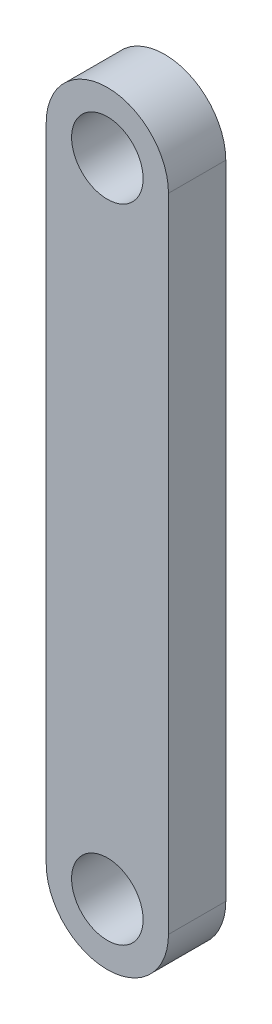
ISO-10303-21;
HEADER;
FILE_DESCRIPTION(('STEP AP214'),'2;1');
FILE_NAME('part.step','',(''),(''),'','','');
FILE_SCHEMA(('AUTOMOTIVE_DESIGN { 1 0 10303 214 1 1 1 1 }'));
ENDSEC;
DATA;
#1=APPLICATION_CONTEXT('core data for automotive mechanical design processes');
#2=APPLICATION_PROTOCOL_DEFINITION('international standard','automotive_design',2000,#1);
#3=PRODUCT_CONTEXT('',#1,'mechanical');
#4=PRODUCT('Part','Part','',(#3));
#5=PRODUCT_RELATED_PRODUCT_CATEGORY('part','',(#4));
#6=PRODUCT_DEFINITION_FORMATION('','',#4);
#7=PRODUCT_DEFINITION_CONTEXT('part definition',#1,'design');
#8=PRODUCT_DEFINITION('design','',#6,#7);
#9=PRODUCT_DEFINITION_SHAPE('','',#8);
#10=(LENGTH_UNIT() NAMED_UNIT(*) SI_UNIT(.MILLI.,.METRE.));
#11=(NAMED_UNIT(*) PLANE_ANGLE_UNIT() SI_UNIT($,.RADIAN.));
#12=(NAMED_UNIT(*) SI_UNIT($,.STERADIAN.) SOLID_ANGLE_UNIT());
#13=UNCERTAINTY_MEASURE_WITH_UNIT(LENGTH_MEASURE(1.E-05),#10,'distance_accuracy_value','');
#14=(GEOMETRIC_REPRESENTATION_CONTEXT(3) GLOBAL_UNCERTAINTY_ASSIGNED_CONTEXT((#13)) GLOBAL_UNIT_ASSIGNED_CONTEXT((#10,
#11,#12)) REPRESENTATION_CONTEXT('',''));
#15=CARTESIAN_POINT('',(0.,0.,0.));
#16=DIRECTION('',(0.,0.,1.));
#17=DIRECTION('',(1.,0.,0.));
#18=AXIS2_PLACEMENT_3D('',#15,#16,#17);
#19=CARTESIAN_POINT('',(0.,33.6,3.));
#20=DIRECTION('',(0.,0.,1.));
#21=DIRECTION('',(1.,0.,0.));
#22=AXIS2_PLACEMENT_3D('',#19,#20,#21);
#23=PLANE('',#22);
#24=CARTESIAN_POINT('',(0.,0.,3.));
#25=DIRECTION('',(0.,0.,1.));
#26=DIRECTION('',(1.,0.,0.));
#27=AXIS2_PLACEMENT_3D('',#24,#25,#26);
#28=CIRCLE('',#27,1.872);
#29=CARTESIAN_POINT('',(1.872,0.,3.));
#30=VERTEX_POINT('',#29);
#31=EDGE_CURVE('E108',#30,#30,#28,.T.);
#32=ORIENTED_EDGE('',*,*,#31,.F.);
#33=EDGE_LOOP('',(#32));
#34=FACE_BOUND('',#33,.T.);
#35=CARTESIAN_POINT('',(0.,33.6,3.));
#36=DIRECTION('',(0.,0.,1.));
#37=DIRECTION('',(1.,0.,0.));
#38=AXIS2_PLACEMENT_3D('',#35,#36,#37);
#39=CIRCLE('',#38,3.2);
#40=CARTESIAN_POINT('',(3.2,33.6,3.));
#41=VERTEX_POINT('',#40);
#42=CARTESIAN_POINT('',(-3.2,33.6,3.));
#43=VERTEX_POINT('',#42);
#44=EDGE_CURVE('E93',#41,#43,#39,.T.);
#45=ORIENTED_EDGE('',*,*,#44,.T.);
#46=DIRECTION('',(0.,-1.,0.));
#47=VECTOR('',#46,1.);
#48=CARTESIAN_POINT('',(-3.2,33.6,3.));
#49=LINE('',#48,#47);
#50=CARTESIAN_POINT('',(-3.2,0.,3.));
#51=VERTEX_POINT('',#50);
#52=EDGE_CURVE('E88',#43,#51,#49,.T.);
#53=ORIENTED_EDGE('',*,*,#52,.T.);
#54=CARTESIAN_POINT('',(0.,0.,3.));
#55=DIRECTION('',(0.,0.,1.));
#56=DIRECTION('',(1.,0.,0.));
#57=AXIS2_PLACEMENT_3D('',#54,#55,#56);
#58=CIRCLE('',#57,3.2);
#59=CARTESIAN_POINT('',(3.19999999999999,0.,3.));
#60=VERTEX_POINT('',#59);
#61=EDGE_CURVE('E91',#51,#60,#58,.T.);
#62=ORIENTED_EDGE('',*,*,#61,.T.);
#63=DIRECTION('',(0.,1.,0.));
#64=VECTOR('',#63,1.);
#65=CARTESIAN_POINT('',(3.2,33.6,3.));
#66=LINE('',#65,#64);
#67=EDGE_CURVE('E58',#60,#41,#66,.T.);
#68=ORIENTED_EDGE('',*,*,#67,.T.);
#69=EDGE_LOOP('',(#45,#53,#62,#68));
#70=FACE_BOUND('',#69,.T.);
#71=CARTESIAN_POINT('',(0.,33.6,3.));
#72=DIRECTION('',(0.,0.,1.));
#73=DIRECTION('',(1.,0.,0.));
#74=AXIS2_PLACEMENT_3D('',#71,#72,#73);
#75=CIRCLE('',#74,1.872);
#76=CARTESIAN_POINT('',(1.872,33.6,3.));
#77=VERTEX_POINT('',#76);
#78=EDGE_CURVE('E123',#77,#77,#75,.T.);
#79=ORIENTED_EDGE('',*,*,#78,.F.);
#80=EDGE_LOOP('',(#79));
#81=FACE_BOUND('',#80,.T.);
#82=ADVANCED_FACE('F41',(#34,#70,#81),#23,.T.);
#83=CARTESIAN_POINT('',(0.,33.6,0.));
#84=DIRECTION('',(0.,0.,1.));
#85=DIRECTION('',(1.,0.,0.));
#86=AXIS2_PLACEMENT_3D('',#83,#84,#85);
#87=PLANE('',#86);
#88=CARTESIAN_POINT('',(0.,33.6,0.));
#89=DIRECTION('',(0.,0.,1.));
#90=DIRECTION('',(1.,0.,0.));
#91=AXIS2_PLACEMENT_3D('',#88,#89,#90);
#92=CIRCLE('',#91,3.2);
#93=CARTESIAN_POINT('',(3.2,33.6,0.));
#94=VERTEX_POINT('',#93);
#95=CARTESIAN_POINT('',(-3.2,33.6,0.));
#96=VERTEX_POINT('',#95);
#97=EDGE_CURVE('E105',#94,#96,#92,.T.);
#98=ORIENTED_EDGE('',*,*,#97,.F.);
#99=DIRECTION('',(0.,1.,0.));
#100=VECTOR('',#99,1.);
#101=CARTESIAN_POINT('',(3.2,33.6,0.));
#102=LINE('',#101,#100);
#103=CARTESIAN_POINT('',(3.19999999999999,0.,0.));
#104=VERTEX_POINT('',#103);
#105=EDGE_CURVE('E81',#104,#94,#102,.T.);
#106=ORIENTED_EDGE('',*,*,#105,.F.);
#107=CARTESIAN_POINT('',(0.,0.,0.));
#108=DIRECTION('',(0.,0.,1.));
#109=DIRECTION('',(1.,0.,0.));
#110=AXIS2_PLACEMENT_3D('',#107,#108,#109);
#111=CIRCLE('',#110,3.2);
#112=CARTESIAN_POINT('',(-3.2,0.,0.));
#113=VERTEX_POINT('',#112);
#114=EDGE_CURVE('E75',#113,#104,#111,.T.);
#115=ORIENTED_EDGE('',*,*,#114,.F.);
#116=DIRECTION('',(0.,-1.,0.));
#117=VECTOR('',#116,1.);
#118=CARTESIAN_POINT('',(-3.2,33.6,0.));
#119=LINE('',#118,#117);
#120=EDGE_CURVE('E97',#96,#113,#119,.T.);
#121=ORIENTED_EDGE('',*,*,#120,.F.);
#122=EDGE_LOOP('',(#98,#106,#115,#121));
#123=FACE_BOUND('',#122,.T.);
#124=CARTESIAN_POINT('',(0.,0.,0.));
#125=DIRECTION('',(0.,0.,1.));
#126=DIRECTION('',(1.,0.,0.));
#127=AXIS2_PLACEMENT_3D('',#124,#125,#126);
#128=CIRCLE('',#127,1.872);
#129=CARTESIAN_POINT('',(1.872,0.,0.));
#130=VERTEX_POINT('',#129);
#131=EDGE_CURVE('E120',#130,#130,#128,.T.);
#132=ORIENTED_EDGE('',*,*,#131,.T.);
#133=EDGE_LOOP('',(#132));
#134=FACE_BOUND('',#133,.T.);
#135=CARTESIAN_POINT('',(0.,33.6,0.));
#136=DIRECTION('',(0.,0.,1.));
#137=DIRECTION('',(1.,0.,0.));
#138=AXIS2_PLACEMENT_3D('',#135,#136,#137);
#139=CIRCLE('',#138,1.872);
#140=CARTESIAN_POINT('',(1.872,33.6,0.));
#141=VERTEX_POINT('',#140);
#142=EDGE_CURVE('E126',#141,#141,#139,.T.);
#143=ORIENTED_EDGE('',*,*,#142,.T.);
#144=EDGE_LOOP('',(#143));
#145=FACE_BOUND('',#144,.T.);
#146=ADVANCED_FACE('F116',(#123,#134,#145),#87,.F.);
#147=CARTESIAN_POINT('',(0.,33.6,3.));
#148=DIRECTION('',(0.,0.,-1.));
#149=DIRECTION('',(-1.,0.,0.));
#150=AXIS2_PLACEMENT_3D('',#147,#148,#149);
#151=CYLINDRICAL_SURFACE('',#150,3.2);
#152=ORIENTED_EDGE('',*,*,#97,.T.);
#153=DIRECTION('',(0.,0.,-1.));
#154=VECTOR('',#153,1.);
#155=CARTESIAN_POINT('',(-3.2,33.6,3.));
#156=LINE('',#155,#154);
#157=EDGE_CURVE('E11',#43,#96,#156,.T.);
#158=ORIENTED_EDGE('',*,*,#157,.F.);
#159=ORIENTED_EDGE('',*,*,#44,.F.);
#160=DIRECTION('',(0.,0.,-1.));
#161=VECTOR('',#160,1.);
#162=CARTESIAN_POINT('',(3.2,33.6,3.));
#163=LINE('',#162,#161);
#164=EDGE_CURVE('E101',#41,#94,#163,.T.);
#165=ORIENTED_EDGE('',*,*,#164,.T.);
#166=EDGE_LOOP('',(#152,#158,#159,#165));
#167=FACE_BOUND('',#166,.T.);
#168=ADVANCED_FACE('F43',(#167),#151,.T.);
#169=CARTESIAN_POINT('',(-3.2,33.6,3.));
#170=DIRECTION('',(1.,0.,0.));
#171=DIRECTION('',(0.,1.,0.));
#172=AXIS2_PLACEMENT_3D('',#169,#170,#171);
#173=PLANE('',#172);
#174=ORIENTED_EDGE('',*,*,#120,.T.);
#175=DIRECTION('',(0.,0.,-1.));
#176=VECTOR('',#175,1.);
#177=CARTESIAN_POINT('',(-3.2,0.,3.));
#178=LINE('',#177,#176);
#179=EDGE_CURVE('E50',#51,#113,#178,.T.);
#180=ORIENTED_EDGE('',*,*,#179,.F.);
#181=ORIENTED_EDGE('',*,*,#52,.F.);
#182=ORIENTED_EDGE('',*,*,#157,.T.);
#183=EDGE_LOOP('',(#174,#180,#181,#182));
#184=FACE_BOUND('',#183,.T.);
#185=ADVANCED_FACE('F96',(#184),#173,.F.);
#186=CARTESIAN_POINT('',(0.,0.,3.));
#187=DIRECTION('',(0.,0.,-1.));
#188=DIRECTION('',(-1.,0.,0.));
#189=AXIS2_PLACEMENT_3D('',#186,#187,#188);
#190=CYLINDRICAL_SURFACE('',#189,3.2);
#191=ORIENTED_EDGE('',*,*,#114,.T.);
#192=DIRECTION('',(0.,0.,-1.));
#193=VECTOR('',#192,1.);
#194=CARTESIAN_POINT('',(3.19999999999999,0.,3.));
#195=LINE('',#194,#193);
#196=EDGE_CURVE('E98',#60,#104,#195,.T.);
#197=ORIENTED_EDGE('',*,*,#196,.F.);
#198=ORIENTED_EDGE('',*,*,#61,.F.);
#199=ORIENTED_EDGE('',*,*,#179,.T.);
#200=EDGE_LOOP('',(#191,#197,#198,#199));
#201=FACE_BOUND('',#200,.T.);
#202=ADVANCED_FACE('F99',(#201),#190,.T.);
#203=CARTESIAN_POINT('',(3.2,33.6,3.));
#204=DIRECTION('',(-1.,0.,0.));
#205=DIRECTION('',(0.,-1.,0.));
#206=AXIS2_PLACEMENT_3D('',#203,#204,#205);
#207=PLANE('',#206);
#208=ORIENTED_EDGE('',*,*,#105,.T.);
#209=ORIENTED_EDGE('',*,*,#164,.F.);
#210=ORIENTED_EDGE('',*,*,#67,.F.);
#211=ORIENTED_EDGE('',*,*,#196,.T.);
#212=EDGE_LOOP('',(#208,#209,#210,#211));
#213=FACE_BOUND('',#212,.T.);
#214=ADVANCED_FACE('F113',(#213),#207,.F.);
#215=CARTESIAN_POINT('',(0.,0.,3.));
#216=DIRECTION('',(0.,0.,-1.));
#217=DIRECTION('',(-1.,0.,0.));
#218=AXIS2_PLACEMENT_3D('',#215,#216,#217);
#219=CYLINDRICAL_SURFACE('',#218,1.872);
#220=ORIENTED_EDGE('',*,*,#31,.T.);
#221=EDGE_LOOP('',(#220));
#222=FACE_BOUND('',#221,.T.);
#223=ORIENTED_EDGE('',*,*,#131,.F.);
#224=EDGE_LOOP('',(#223));
#225=FACE_BOUND('',#224,.T.);
#226=ADVANCED_FACE('F143',(#222,#225),#219,.F.);
#227=CARTESIAN_POINT('',(0.,33.6,3.));
#228=DIRECTION('',(0.,0.,-1.));
#229=DIRECTION('',(-1.,0.,0.));
#230=AXIS2_PLACEMENT_3D('',#227,#228,#229);
#231=CYLINDRICAL_SURFACE('',#230,1.872);
#232=ORIENTED_EDGE('',*,*,#78,.T.);
#233=EDGE_LOOP('',(#232));
#234=FACE_BOUND('',#233,.T.);
#235=ORIENTED_EDGE('',*,*,#142,.F.);
#236=EDGE_LOOP('',(#235));
#237=FACE_BOUND('',#236,.T.);
#238=ADVANCED_FACE('F132',(#234,#237),#231,.F.);
#239=CLOSED_SHELL('',(#82,#146,#168,#185,#202,#214,#226,#238));
#240=MANIFOLD_SOLID_BREP('B2',#239);
#241=ADVANCED_BREP_SHAPE_REPRESENTATION('',(#18,#240),#14);
#242=SHAPE_DEFINITION_REPRESENTATION(#9,#241);
ENDSEC;
END-ISO-10303-21;
